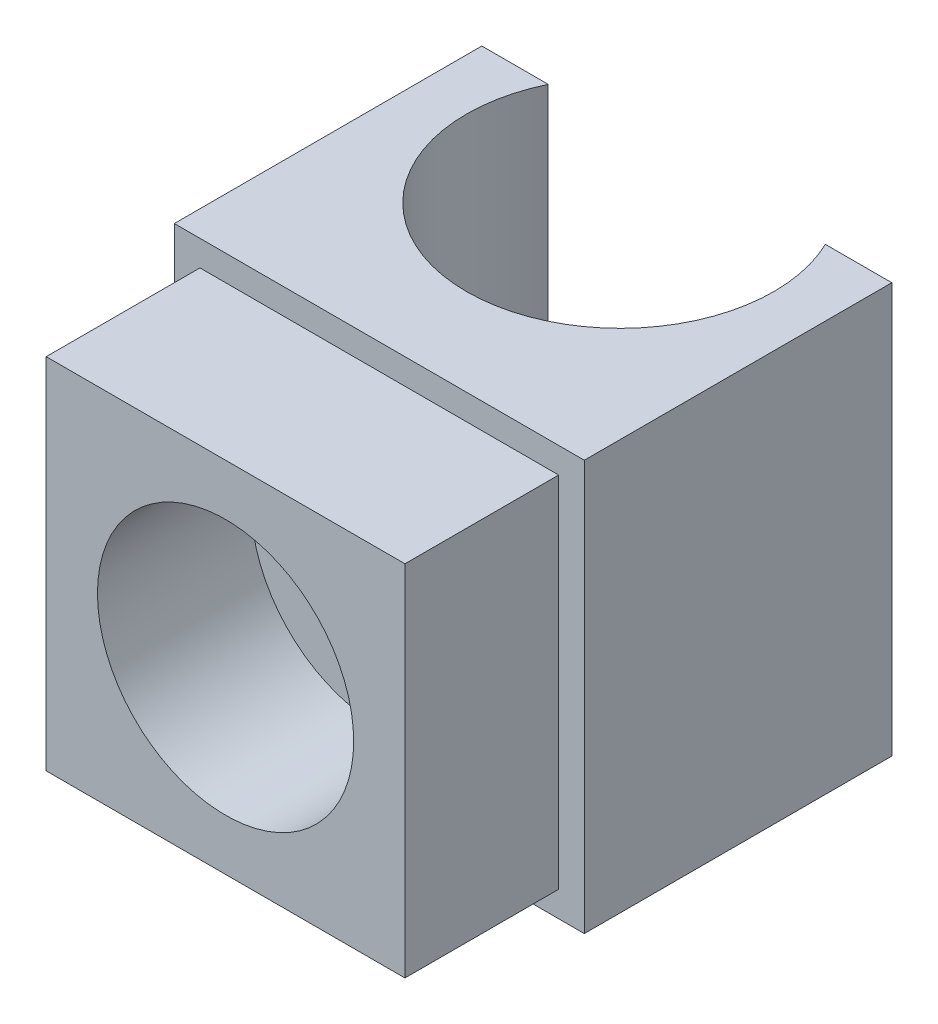
ISO-10303-21;
HEADER;
FILE_DESCRIPTION(('STEP AP214'),'2;1');
FILE_NAME('part.step','',(''),(''),'','','');
FILE_SCHEMA(('AUTOMOTIVE_DESIGN { 1 0 10303 214 1 1 1 1 }'));
ENDSEC;
DATA;
#1=APPLICATION_CONTEXT('core data for automotive mechanical design processes');
#2=APPLICATION_PROTOCOL_DEFINITION('international standard','automotive_design',2000,#1);
#3=PRODUCT_CONTEXT('',#1,'mechanical');
#4=PRODUCT('Part','Part','',(#3));
#5=PRODUCT_RELATED_PRODUCT_CATEGORY('part','',(#4));
#6=PRODUCT_DEFINITION_FORMATION('','',#4);
#7=PRODUCT_DEFINITION_CONTEXT('part definition',#1,'design');
#8=PRODUCT_DEFINITION('design','',#6,#7);
#9=PRODUCT_DEFINITION_SHAPE('','',#8);
#10=(LENGTH_UNIT() NAMED_UNIT(*) SI_UNIT(.MILLI.,.METRE.));
#11=(NAMED_UNIT(*) PLANE_ANGLE_UNIT() SI_UNIT($,.RADIAN.));
#12=(NAMED_UNIT(*) SI_UNIT($,.STERADIAN.) SOLID_ANGLE_UNIT());
#13=UNCERTAINTY_MEASURE_WITH_UNIT(LENGTH_MEASURE(1.E-05),#10,'distance_accuracy_value','');
#14=(GEOMETRIC_REPRESENTATION_CONTEXT(3) GLOBAL_UNCERTAINTY_ASSIGNED_CONTEXT((#13)) GLOBAL_UNIT_ASSIGNED_CONTEXT((#10,
#11,#12)) REPRESENTATION_CONTEXT('',''));
#15=CARTESIAN_POINT('',(0.,0.,0.));
#16=DIRECTION('',(0.,0.,1.));
#17=DIRECTION('',(1.,0.,0.));
#18=AXIS2_PLACEMENT_3D('',#15,#16,#17);
#19=CARTESIAN_POINT('',(-40.,-40.,-13.));
#20=DIRECTION('',(-1.,0.,0.));
#21=DIRECTION('',(0.,0.,1.));
#22=AXIS2_PLACEMENT_3D('',#19,#20,#21);
#23=PLANE('',#22);
#24=DIRECTION('',(0.,1.,0.));
#25=VECTOR('',#24,1.);
#26=CARTESIAN_POINT('',(-40.,-40.,47.));
#27=LINE('',#26,#25);
#28=CARTESIAN_POINT('',(-40.,-40.,47.));
#29=VERTEX_POINT('',#28);
#30=CARTESIAN_POINT('',(-40.,40.,47.));
#31=VERTEX_POINT('',#30);
#32=EDGE_CURVE('E40',#29,#31,#27,.T.);
#33=ORIENTED_EDGE('',*,*,#32,.T.);
#34=DIRECTION('',(0.,0.,1.));
#35=VECTOR('',#34,1.);
#36=CARTESIAN_POINT('',(-40.,40.,-13.));
#37=LINE('',#36,#35);
#38=CARTESIAN_POINT('',(-40.,40.,-13.));
#39=VERTEX_POINT('',#38);
#40=EDGE_CURVE('E134',#39,#31,#37,.T.);
#41=ORIENTED_EDGE('',*,*,#40,.F.);
#42=DIRECTION('',(0.,1.,0.));
#43=VECTOR('',#42,1.);
#44=CARTESIAN_POINT('',(-40.,-40.,-13.));
#45=LINE('',#44,#43);
#46=CARTESIAN_POINT('',(-40.,-40.,-13.));
#47=VERTEX_POINT('',#46);
#48=EDGE_CURVE('E11',#47,#39,#45,.T.);
#49=ORIENTED_EDGE('',*,*,#48,.F.);
#50=DIRECTION('',(0.,0.,1.));
#51=VECTOR('',#50,1.);
#52=CARTESIAN_POINT('',(-40.,-40.,-13.));
#53=LINE('',#52,#51);
#54=EDGE_CURVE('E157',#47,#29,#53,.T.);
#55=ORIENTED_EDGE('',*,*,#54,.T.);
#56=EDGE_LOOP('',(#33,#41,#49,#55));
#57=FACE_BOUND('',#56,.T.);
#58=ADVANCED_FACE('F37',(#57),#23,.T.);
#59=CARTESIAN_POINT('',(-40.,-40.,-13.));
#60=DIRECTION('',(0.,0.,-1.));
#61=DIRECTION('',(-1.,0.,0.));
#62=AXIS2_PLACEMENT_3D('',#59,#60,#61);
#63=PLANE('',#62);
#64=ORIENTED_EDGE('',*,*,#48,.T.);
#65=DIRECTION('',(-1.,0.,0.));
#66=VECTOR('',#65,1.);
#67=CARTESIAN_POINT('',(-40.,40.,-13.));
#68=LINE('',#67,#66);
#69=CARTESIAN_POINT('',(-27.0370116691915,40.,-13.));
#70=VERTEX_POINT('',#69);
#71=EDGE_CURVE('E154',#70,#39,#68,.T.);
#72=ORIENTED_EDGE('',*,*,#71,.F.);
#73=DIRECTION('',(0.,1.,0.));
#74=VECTOR('',#73,1.);
#75=CARTESIAN_POINT('',(-27.0370116691915,-40.,-13.));
#76=LINE('',#75,#74);
#77=CARTESIAN_POINT('',(-27.0370116691915,-40.,-13.));
#78=VERTEX_POINT('',#77);
#79=EDGE_CURVE('E45',#78,#70,#76,.T.);
#80=ORIENTED_EDGE('',*,*,#79,.F.);
#81=DIRECTION('',(-1.,0.,0.));
#82=VECTOR('',#81,1.);
#83=CARTESIAN_POINT('',(-40.,-40.,-13.));
#84=LINE('',#83,#82);
#85=EDGE_CURVE('E172',#78,#47,#84,.T.);
#86=ORIENTED_EDGE('',*,*,#85,.T.);
#87=EDGE_LOOP('',(#64,#72,#80,#86));
#88=FACE_BOUND('',#87,.T.);
#89=ADVANCED_FACE('F193',(#88),#63,.T.);
#90=CARTESIAN_POINT('',(0.,-40.,0.));
#91=DIRECTION('',(0.,1.,0.));
#92=DIRECTION('',(0.,0.,1.));
#93=AXIS2_PLACEMENT_3D('',#90,#91,#92);
#94=CYLINDRICAL_SURFACE('',#93,30.);
#95=ORIENTED_EDGE('',*,*,#79,.T.);
#96=CARTESIAN_POINT('',(0.,40.,0.));
#97=DIRECTION('',(0.,-1.,0.));
#98=DIRECTION('',(0.,0.,1.));
#99=AXIS2_PLACEMENT_3D('',#96,#97,#98);
#100=CIRCLE('',#99,30.);
#101=CARTESIAN_POINT('',(27.0370116691916,40.,-13.));
#102=VERTEX_POINT('',#101);
#103=EDGE_CURVE('E151',#102,#70,#100,.T.);
#104=ORIENTED_EDGE('',*,*,#103,.F.);
#105=DIRECTION('',(0.,1.,0.));
#106=VECTOR('',#105,1.);
#107=CARTESIAN_POINT('',(27.0370116691916,-40.,-13.));
#108=LINE('',#107,#106);
#109=CARTESIAN_POINT('',(27.0370116691916,-40.,-13.));
#110=VERTEX_POINT('',#109);
#111=EDGE_CURVE('E176',#110,#102,#108,.T.);
#112=ORIENTED_EDGE('',*,*,#111,.F.);
#113=CARTESIAN_POINT('',(0.,-40.,0.));
#114=DIRECTION('',(0.,-1.,0.));
#115=DIRECTION('',(0.,0.,1.));
#116=AXIS2_PLACEMENT_3D('',#113,#114,#115);
#117=CIRCLE('',#116,30.);
#118=EDGE_CURVE('E169',#110,#78,#117,.T.);
#119=ORIENTED_EDGE('',*,*,#118,.T.);
#120=EDGE_LOOP('',(#95,#104,#112,#119));
#121=FACE_BOUND('',#120,.T.);
#122=ADVANCED_FACE('F206',(#121),#94,.F.);
#123=CARTESIAN_POINT('',(27.0370116691915,-40.,-13.));
#124=DIRECTION('',(0.,0.,-1.));
#125=DIRECTION('',(-1.,0.,0.));
#126=AXIS2_PLACEMENT_3D('',#123,#124,#125);
#127=PLANE('',#126);
#128=ORIENTED_EDGE('',*,*,#111,.T.);
#129=DIRECTION('',(-1.,0.,0.));
#130=VECTOR('',#129,1.);
#131=CARTESIAN_POINT('',(27.0370116691915,40.,-13.));
#132=LINE('',#131,#130);
#133=CARTESIAN_POINT('',(40.,40.,-13.));
#134=VERTEX_POINT('',#133);
#135=EDGE_CURVE('E148',#134,#102,#132,.T.);
#136=ORIENTED_EDGE('',*,*,#135,.F.);
#137=DIRECTION('',(0.,1.,0.));
#138=VECTOR('',#137,1.);
#139=CARTESIAN_POINT('',(40.,-40.,-13.));
#140=LINE('',#139,#138);
#141=CARTESIAN_POINT('',(40.,-40.,-13.));
#142=VERTEX_POINT('',#141);
#143=EDGE_CURVE('E178',#142,#134,#140,.T.);
#144=ORIENTED_EDGE('',*,*,#143,.F.);
#145=DIRECTION('',(-1.,0.,0.));
#146=VECTOR('',#145,1.);
#147=CARTESIAN_POINT('',(27.0370116691915,-40.,-13.));
#148=LINE('',#147,#146);
#149=EDGE_CURVE('E166',#142,#110,#148,.T.);
#150=ORIENTED_EDGE('',*,*,#149,.T.);
#151=EDGE_LOOP('',(#128,#136,#144,#150));
#152=FACE_BOUND('',#151,.T.);
#153=ADVANCED_FACE('F204',(#152),#127,.T.);
#154=CARTESIAN_POINT('',(40.,-40.,-13.));
#155=DIRECTION('',(1.,0.,0.));
#156=DIRECTION('',(0.,0.,-1.));
#157=AXIS2_PLACEMENT_3D('',#154,#155,#156);
#158=PLANE('',#157);
#159=ORIENTED_EDGE('',*,*,#143,.T.);
#160=DIRECTION('',(0.,0.,-1.));
#161=VECTOR('',#160,1.);
#162=CARTESIAN_POINT('',(40.,40.,-13.));
#163=LINE('',#162,#161);
#164=CARTESIAN_POINT('',(40.,40.,47.));
#165=VERTEX_POINT('',#164);
#166=EDGE_CURVE('E145',#165,#134,#163,.T.);
#167=ORIENTED_EDGE('',*,*,#166,.F.);
#168=DIRECTION('',(0.,1.,0.));
#169=VECTOR('',#168,1.);
#170=CARTESIAN_POINT('',(40.,-40.,47.));
#171=LINE('',#170,#169);
#172=CARTESIAN_POINT('',(40.,-40.,47.));
#173=VERTEX_POINT('',#172);
#174=EDGE_CURVE('E179',#173,#165,#171,.T.);
#175=ORIENTED_EDGE('',*,*,#174,.F.);
#176=DIRECTION('',(0.,0.,-1.));
#177=VECTOR('',#176,1.);
#178=CARTESIAN_POINT('',(40.,-40.,-13.));
#179=LINE('',#178,#177);
#180=EDGE_CURVE('E163',#173,#142,#179,.T.);
#181=ORIENTED_EDGE('',*,*,#180,.T.);
#182=EDGE_LOOP('',(#159,#167,#175,#181));
#183=FACE_BOUND('',#182,.T.);
#184=ADVANCED_FACE('F201',(#183),#158,.T.);
#185=CARTESIAN_POINT('',(-40.,-40.,47.));
#186=DIRECTION('',(0.,0.,1.));
#187=DIRECTION('',(1.,0.,0.));
#188=AXIS2_PLACEMENT_3D('',#185,#186,#187);
#189=PLANE('',#188);
#190=DIRECTION('',(0.,1.,0.));
#191=VECTOR('',#190,1.);
#192=CARTESIAN_POINT('',(35.,-35.,47.));
#193=LINE('',#192,#191);
#194=CARTESIAN_POINT('',(35.,-35.,47.));
#195=VERTEX_POINT('',#194);
#196=CARTESIAN_POINT('',(35.,35.,47.));
#197=VERTEX_POINT('',#196);
#198=EDGE_CURVE('E53',#195,#197,#193,.T.);
#199=ORIENTED_EDGE('',*,*,#198,.F.);
#200=DIRECTION('',(1.,0.,0.));
#201=VECTOR('',#200,1.);
#202=CARTESIAN_POINT('',(-35.,-35.,47.));
#203=LINE('',#202,#201);
#204=CARTESIAN_POINT('',(-35.,-35.,47.));
#205=VERTEX_POINT('',#204);
#206=EDGE_CURVE('E57',#205,#195,#203,.T.);
#207=ORIENTED_EDGE('',*,*,#206,.F.);
#208=DIRECTION('',(0.,-1.,0.));
#209=VECTOR('',#208,1.);
#210=CARTESIAN_POINT('',(-35.,-35.,47.));
#211=LINE('',#210,#209);
#212=CARTESIAN_POINT('',(-35.,35.,47.));
#213=VERTEX_POINT('',#212);
#214=EDGE_CURVE('E378',#213,#205,#211,.T.);
#215=ORIENTED_EDGE('',*,*,#214,.F.);
#216=DIRECTION('',(-1.,0.,0.));
#217=VECTOR('',#216,1.);
#218=CARTESIAN_POINT('',(-35.,35.,47.));
#219=LINE('',#218,#217);
#220=EDGE_CURVE('E369',#197,#213,#219,.T.);
#221=ORIENTED_EDGE('',*,*,#220,.F.);
#222=EDGE_LOOP('',(#199,#207,#215,#221));
#223=FACE_BOUND('',#222,.T.);
#224=ORIENTED_EDGE('',*,*,#174,.T.);
#225=DIRECTION('',(1.,0.,0.));
#226=VECTOR('',#225,1.);
#227=CARTESIAN_POINT('',(-40.,40.,47.));
#228=LINE('',#227,#226);
#229=EDGE_CURVE('E137',#31,#165,#228,.T.);
#230=ORIENTED_EDGE('',*,*,#229,.F.);
#231=ORIENTED_EDGE('',*,*,#32,.F.);
#232=DIRECTION('',(1.,0.,0.));
#233=VECTOR('',#232,1.);
#234=CARTESIAN_POINT('',(-40.,-40.,47.));
#235=LINE('',#234,#233);
#236=EDGE_CURVE('E160',#29,#173,#235,.T.);
#237=ORIENTED_EDGE('',*,*,#236,.T.);
#238=EDGE_LOOP('',(#224,#230,#231,#237));
#239=FACE_BOUND('',#238,.T.);
#240=ADVANCED_FACE('F186',(#223,#239),#189,.T.);
#241=CARTESIAN_POINT('',(0.,-40.,0.));
#242=DIRECTION('',(0.,1.,0.));
#243=DIRECTION('',(0.,0.,1.));
#244=AXIS2_PLACEMENT_3D('',#241,#242,#243);
#245=PLANE('',#244);
#246=ORIENTED_EDGE('',*,*,#54,.F.);
#247=ORIENTED_EDGE('',*,*,#85,.F.);
#248=ORIENTED_EDGE('',*,*,#118,.F.);
#249=ORIENTED_EDGE('',*,*,#149,.F.);
#250=ORIENTED_EDGE('',*,*,#180,.F.);
#251=ORIENTED_EDGE('',*,*,#236,.F.);
#252=EDGE_LOOP('',(#246,#247,#248,#249,#250,#251));
#253=FACE_BOUND('',#252,.T.);
#254=ADVANCED_FACE('F196',(#253),#245,.F.);
#255=CARTESIAN_POINT('',(0.,40.,0.));
#256=DIRECTION('',(0.,1.,0.));
#257=DIRECTION('',(0.,0.,1.));
#258=AXIS2_PLACEMENT_3D('',#255,#256,#257);
#259=PLANE('',#258);
#260=ORIENTED_EDGE('',*,*,#40,.T.);
#261=ORIENTED_EDGE('',*,*,#229,.T.);
#262=ORIENTED_EDGE('',*,*,#166,.T.);
#263=ORIENTED_EDGE('',*,*,#135,.T.);
#264=ORIENTED_EDGE('',*,*,#103,.T.);
#265=ORIENTED_EDGE('',*,*,#71,.T.);
#266=EDGE_LOOP('',(#260,#261,#262,#263,#264,#265));
#267=FACE_BOUND('',#266,.T.);
#268=ADVANCED_FACE('F189',(#267),#259,.T.);
#269=CARTESIAN_POINT('',(35.,-35.,77.));
#270=DIRECTION('',(-1.,0.,0.));
#271=DIRECTION('',(0.,0.,1.));
#272=AXIS2_PLACEMENT_3D('',#269,#270,#271);
#273=PLANE('',#272);
#274=ORIENTED_EDGE('',*,*,#198,.T.);
#275=DIRECTION('',(0.,0.,-1.));
#276=VECTOR('',#275,1.);
#277=CARTESIAN_POINT('',(35.,35.,77.));
#278=LINE('',#277,#276);
#279=CARTESIAN_POINT('',(35.,35.,77.));
#280=VERTEX_POINT('',#279);
#281=EDGE_CURVE('E117',#280,#197,#278,.T.);
#282=ORIENTED_EDGE('',*,*,#281,.F.);
#283=DIRECTION('',(0.,1.,0.));
#284=VECTOR('',#283,1.);
#285=CARTESIAN_POINT('',(35.,-35.,77.));
#286=LINE('',#285,#284);
#287=CARTESIAN_POINT('',(35.,-35.,77.));
#288=VERTEX_POINT('',#287);
#289=EDGE_CURVE('E123',#288,#280,#286,.T.);
#290=ORIENTED_EDGE('',*,*,#289,.F.);
#291=DIRECTION('',(0.,0.,-1.));
#292=VECTOR('',#291,1.);
#293=CARTESIAN_POINT('',(35.,-35.,77.));
#294=LINE('',#293,#292);
#295=EDGE_CURVE('E375',#288,#195,#294,.T.);
#296=ORIENTED_EDGE('',*,*,#295,.T.);
#297=EDGE_LOOP('',(#274,#282,#290,#296));
#298=FACE_BOUND('',#297,.T.);
#299=ADVANCED_FACE('F133',(#298),#273,.F.);
#300=CARTESIAN_POINT('',(-35.,35.,77.));
#301=DIRECTION('',(0.,-1.,0.));
#302=DIRECTION('',(0.,0.,-1.));
#303=AXIS2_PLACEMENT_3D('',#300,#301,#302);
#304=PLANE('',#303);
#305=ORIENTED_EDGE('',*,*,#220,.T.);
#306=DIRECTION('',(0.,0.,-1.));
#307=VECTOR('',#306,1.);
#308=CARTESIAN_POINT('',(-35.,35.,77.));
#309=LINE('',#308,#307);
#310=CARTESIAN_POINT('',(-35.,35.,77.));
#311=VERTEX_POINT('',#310);
#312=EDGE_CURVE('E119',#311,#213,#309,.T.);
#313=ORIENTED_EDGE('',*,*,#312,.F.);
#314=DIRECTION('',(-1.,0.,0.));
#315=VECTOR('',#314,1.);
#316=CARTESIAN_POINT('',(-35.,35.,77.));
#317=LINE('',#316,#315);
#318=EDGE_CURVE('E112',#280,#311,#317,.T.);
#319=ORIENTED_EDGE('',*,*,#318,.F.);
#320=ORIENTED_EDGE('',*,*,#281,.T.);
#321=EDGE_LOOP('',(#305,#313,#319,#320));
#322=FACE_BOUND('',#321,.T.);
#323=ADVANCED_FACE('F115',(#322),#304,.F.);
#324=CARTESIAN_POINT('',(-35.,-35.,77.));
#325=DIRECTION('',(1.,0.,0.));
#326=DIRECTION('',(0.,0.,-1.));
#327=AXIS2_PLACEMENT_3D('',#324,#325,#326);
#328=PLANE('',#327);
#329=ORIENTED_EDGE('',*,*,#214,.T.);
#330=DIRECTION('',(0.,0.,-1.));
#331=VECTOR('',#330,1.);
#332=CARTESIAN_POINT('',(-35.,-35.,77.));
#333=LINE('',#332,#331);
#334=CARTESIAN_POINT('',(-35.,-35.,77.));
#335=VERTEX_POINT('',#334);
#336=EDGE_CURVE('E139',#335,#205,#333,.T.);
#337=ORIENTED_EDGE('',*,*,#336,.F.);
#338=DIRECTION('',(0.,-1.,0.));
#339=VECTOR('',#338,1.);
#340=CARTESIAN_POINT('',(-35.,-35.,77.));
#341=LINE('',#340,#339);
#342=EDGE_CURVE('E122',#311,#335,#341,.T.);
#343=ORIENTED_EDGE('',*,*,#342,.F.);
#344=ORIENTED_EDGE('',*,*,#312,.T.);
#345=EDGE_LOOP('',(#329,#337,#343,#344));
#346=FACE_BOUND('',#345,.T.);
#347=ADVANCED_FACE('F288',(#346),#328,.F.);
#348=CARTESIAN_POINT('',(-35.,-35.,77.));
#349=DIRECTION('',(0.,1.,0.));
#350=DIRECTION('',(0.,0.,1.));
#351=AXIS2_PLACEMENT_3D('',#348,#349,#350);
#352=PLANE('',#351);
#353=ORIENTED_EDGE('',*,*,#206,.T.);
#354=ORIENTED_EDGE('',*,*,#295,.F.);
#355=DIRECTION('',(1.,0.,0.));
#356=VECTOR('',#355,1.);
#357=CARTESIAN_POINT('',(-35.,-35.,77.));
#358=LINE('',#357,#356);
#359=EDGE_CURVE('E128',#335,#288,#358,.T.);
#360=ORIENTED_EDGE('',*,*,#359,.F.);
#361=ORIENTED_EDGE('',*,*,#336,.T.);
#362=EDGE_LOOP('',(#353,#354,#360,#361));
#363=FACE_BOUND('',#362,.T.);
#364=ADVANCED_FACE('F298',(#363),#352,.F.);
#365=CARTESIAN_POINT('',(0.,0.,77.));
#366=DIRECTION('',(0.,0.,-1.));
#367=DIRECTION('',(-1.,0.,0.));
#368=AXIS2_PLACEMENT_3D('',#365,#366,#367);
#369=PLANE('',#368);
#370=CARTESIAN_POINT('',(0.,0.,77.));
#371=DIRECTION('',(0.,0.,1.));
#372=DIRECTION('',(1.,0.,0.));
#373=AXIS2_PLACEMENT_3D('',#370,#371,#372);
#374=CIRCLE('',#373,25.);
#375=CARTESIAN_POINT('',(25.,0.,77.));
#376=VERTEX_POINT('',#375);
#377=EDGE_CURVE('E367',#376,#376,#374,.T.);
#378=ORIENTED_EDGE('',*,*,#377,.F.);
#379=EDGE_LOOP('',(#378));
#380=FACE_BOUND('',#379,.T.);
#381=ORIENTED_EDGE('',*,*,#289,.T.);
#382=ORIENTED_EDGE('',*,*,#318,.T.);
#383=ORIENTED_EDGE('',*,*,#342,.T.);
#384=ORIENTED_EDGE('',*,*,#359,.T.);
#385=EDGE_LOOP('',(#381,#382,#383,#384));
#386=FACE_BOUND('',#385,.T.);
#387=ADVANCED_FACE('F126',(#380,#386),#369,.F.);
#388=CARTESIAN_POINT('',(0.,0.,47.));
#389=DIRECTION('',(0.,0.,1.));
#390=DIRECTION('',(1.,0.,0.));
#391=AXIS2_PLACEMENT_3D('',#388,#389,#390);
#392=CYLINDRICAL_SURFACE('',#391,25.);
#393=CARTESIAN_POINT('',(0.,0.,47.));
#394=DIRECTION('',(0.,0.,1.));
#395=DIRECTION('',(1.,0.,0.));
#396=AXIS2_PLACEMENT_3D('',#393,#394,#395);
#397=CIRCLE('',#396,25.);
#398=CARTESIAN_POINT('',(25.,0.,47.));
#399=VERTEX_POINT('',#398);
#400=EDGE_CURVE('E366',#399,#399,#397,.T.);
#401=ORIENTED_EDGE('',*,*,#400,.F.);
#402=EDGE_LOOP('',(#401));
#403=FACE_BOUND('',#402,.T.);
#404=ORIENTED_EDGE('',*,*,#377,.T.);
#405=EDGE_LOOP('',(#404));
#406=FACE_BOUND('',#405,.T.);
#407=ADVANCED_FACE('F319',(#403,#406),#392,.F.);
#408=CARTESIAN_POINT('',(0.,0.,47.));
#409=DIRECTION('',(0.,0.,1.));
#410=DIRECTION('',(1.,0.,0.));
#411=AXIS2_PLACEMENT_3D('',#408,#409,#410);
#412=PLANE('',#411);
#413=ORIENTED_EDGE('',*,*,#400,.T.);
#414=EDGE_LOOP('',(#413));
#415=FACE_BOUND('',#414,.T.);
#416=ADVANCED_FACE('F330',(#415),#412,.T.);
#417=CLOSED_SHELL('',(#58,#89,#122,#153,#184,#240,#254,#268,#299,#323,#347,#364,#387,#407,#416));
#418=MANIFOLD_SOLID_BREP('B2',#417);
#419=ADVANCED_BREP_SHAPE_REPRESENTATION('',(#18,#418),#14);
#420=SHAPE_DEFINITION_REPRESENTATION(#9,#419);
ENDSEC;
END-ISO-10303-21;
